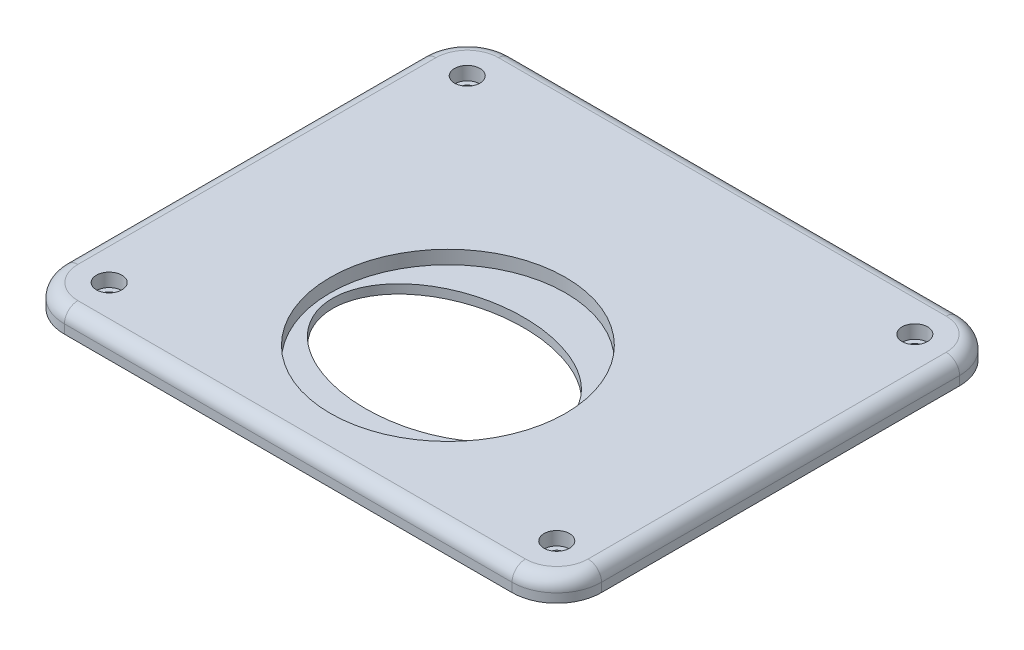
ISO-10303-21;
HEADER;
FILE_DESCRIPTION(('STEP AP214'),'2;1');
FILE_NAME('part.step','',(''),(''),'','','');
FILE_SCHEMA(('AUTOMOTIVE_DESIGN { 1 0 10303 214 1 1 1 1 }'));
ENDSEC;
DATA;
#1=APPLICATION_CONTEXT('core data for automotive mechanical design processes');
#2=APPLICATION_PROTOCOL_DEFINITION('international standard','automotive_design',2000,#1);
#3=PRODUCT_CONTEXT('',#1,'mechanical');
#4=PRODUCT('Part','Part','',(#3));
#5=PRODUCT_RELATED_PRODUCT_CATEGORY('part','',(#4));
#6=PRODUCT_DEFINITION_FORMATION('','',#4);
#7=PRODUCT_DEFINITION_CONTEXT('part definition',#1,'design');
#8=PRODUCT_DEFINITION('design','',#6,#7);
#9=PRODUCT_DEFINITION_SHAPE('','',#8);
#10=(LENGTH_UNIT() NAMED_UNIT(*) SI_UNIT(.MILLI.,.METRE.));
#11=(NAMED_UNIT(*) PLANE_ANGLE_UNIT() SI_UNIT($,.RADIAN.));
#12=(NAMED_UNIT(*) SI_UNIT($,.STERADIAN.) SOLID_ANGLE_UNIT());
#13=UNCERTAINTY_MEASURE_WITH_UNIT(LENGTH_MEASURE(1.E-05),#10,'distance_accuracy_value','');
#14=(GEOMETRIC_REPRESENTATION_CONTEXT(3) GLOBAL_UNCERTAINTY_ASSIGNED_CONTEXT((#13)) GLOBAL_UNIT_ASSIGNED_CONTEXT((#10,
#11,#12)) REPRESENTATION_CONTEXT('',''));
#15=CARTESIAN_POINT('',(0.,0.,0.));
#16=DIRECTION('',(0.,0.,1.));
#17=DIRECTION('',(1.,0.,0.));
#18=AXIS2_PLACEMENT_3D('',#15,#16,#17);
#19=CARTESIAN_POINT('',(50.,52.,25.6776695296637));
#20=DIRECTION('',(0.,1.,0.));
#21=DIRECTION('',(0.,0.,1.));
#22=AXIS2_PLACEMENT_3D('',#19,#20,#21);
#23=PLANE('',#22);
#24=CARTESIAN_POINT('',(-50.,52.,-54.3223304703363));
#25=DIRECTION('',(0.,1.,0.));
#26=DIRECTION('',(0.,0.,1.));
#27=AXIS2_PLACEMENT_3D('',#24,#25,#26);
#28=CIRCLE('',#27,1.7);
#29=CARTESIAN_POINT('',(-50.,52.,-52.6223304703363));
#30=VERTEX_POINT('',#29);
#31=EDGE_CURVE('E571',#30,#30,#28,.T.);
#32=ORIENTED_EDGE('',*,*,#31,.F.);
#33=EDGE_LOOP('',(#32));
#34=FACE_BOUND('',#33,.T.);
#35=CARTESIAN_POINT('',(-50.,52.,-54.3223304703363));
#36=DIRECTION('',(0.,1.,0.));
#37=DIRECTION('',(0.,0.,1.));
#38=AXIS2_PLACEMENT_3D('',#35,#36,#37);
#39=CIRCLE('',#38,2.85);
#40=CARTESIAN_POINT('',(-50.,52.,-51.4723304703363));
#41=VERTEX_POINT('',#40);
#42=EDGE_CURVE('E544',#41,#41,#39,.T.);
#43=ORIENTED_EDGE('',*,*,#42,.T.);
#44=EDGE_LOOP('',(#43));
#45=FACE_BOUND('',#44,.T.);
#46=ADVANCED_FACE('F311',(#34,#45),#23,.T.);
#47=CARTESIAN_POINT('',(50.,52.,-54.3223304703363));
#48=DIRECTION('',(0.,1.,0.));
#49=DIRECTION('',(0.,0.,1.));
#50=AXIS2_PLACEMENT_3D('',#47,#48,#49);
#51=CIRCLE('',#50,1.7);
#52=CARTESIAN_POINT('',(50.,52.,-52.6223304703363));
#53=VERTEX_POINT('',#52);
#54=EDGE_CURVE('E565',#53,#53,#51,.T.);
#55=ORIENTED_EDGE('',*,*,#54,.F.);
#56=EDGE_LOOP('',(#55));
#57=FACE_BOUND('',#56,.T.);
#58=CARTESIAN_POINT('',(50.,52.,-54.3223304703363));
#59=DIRECTION('',(0.,1.,0.));
#60=DIRECTION('',(0.,0.,1.));
#61=AXIS2_PLACEMENT_3D('',#58,#59,#60);
#62=CIRCLE('',#61,2.85);
#63=CARTESIAN_POINT('',(50.,52.,-51.4723304703363));
#64=VERTEX_POINT('',#63);
#65=EDGE_CURVE('E538',#64,#64,#62,.T.);
#66=ORIENTED_EDGE('',*,*,#65,.T.);
#67=EDGE_LOOP('',(#66));
#68=FACE_BOUND('',#67,.T.);
#69=ADVANCED_FACE('F587',(#57,#68),#23,.T.);
#70=CARTESIAN_POINT('',(50.,52.,25.6776695296637));
#71=DIRECTION('',(0.,1.,0.));
#72=DIRECTION('',(0.,0.,1.));
#73=AXIS2_PLACEMENT_3D('',#70,#71,#72);
#74=CIRCLE('',#73,1.7);
#75=CARTESIAN_POINT('',(50.,52.,27.3776695296637));
#76=VERTEX_POINT('',#75);
#77=EDGE_CURVE('E559',#76,#76,#74,.T.);
#78=ORIENTED_EDGE('',*,*,#77,.F.);
#79=EDGE_LOOP('',(#78));
#80=FACE_BOUND('',#79,.T.);
#81=CARTESIAN_POINT('',(50.,52.,25.6776695296637));
#82=DIRECTION('',(0.,1.,0.));
#83=DIRECTION('',(0.,0.,1.));
#84=AXIS2_PLACEMENT_3D('',#81,#82,#83);
#85=CIRCLE('',#84,2.85);
#86=CARTESIAN_POINT('',(50.,52.,28.5276695296637));
#87=VERTEX_POINT('',#86);
#88=EDGE_CURVE('E532',#87,#87,#85,.T.);
#89=ORIENTED_EDGE('',*,*,#88,.T.);
#90=EDGE_LOOP('',(#89));
#91=FACE_BOUND('',#90,.T.);
#92=ADVANCED_FACE('F698',(#80,#91),#23,.T.);
#93=CARTESIAN_POINT('',(-50.,52.,25.6776695296637));
#94=DIRECTION('',(0.,1.,0.));
#95=DIRECTION('',(0.,0.,1.));
#96=AXIS2_PLACEMENT_3D('',#93,#94,#95);
#97=CIRCLE('',#96,1.7);
#98=CARTESIAN_POINT('',(-50.,52.,27.3776695296637));
#99=VERTEX_POINT('',#98);
#100=EDGE_CURVE('E553',#99,#99,#97,.T.);
#101=ORIENTED_EDGE('',*,*,#100,.F.);
#102=EDGE_LOOP('',(#101));
#103=FACE_BOUND('',#102,.T.);
#104=CARTESIAN_POINT('',(-50.,52.,25.6776695296637));
#105=DIRECTION('',(0.,1.,0.));
#106=DIRECTION('',(0.,0.,1.));
#107=AXIS2_PLACEMENT_3D('',#104,#105,#106);
#108=CIRCLE('',#107,2.85);
#109=CARTESIAN_POINT('',(-50.,52.,28.5276695296637));
#110=VERTEX_POINT('',#109);
#111=EDGE_CURVE('E526',#110,#110,#108,.T.);
#112=ORIENTED_EDGE('',*,*,#111,.T.);
#113=EDGE_LOOP('',(#112));
#114=FACE_BOUND('',#113,.T.);
#115=ADVANCED_FACE('F700',(#103,#114),#23,.T.);
#116=CARTESIAN_POINT('',(0.,52.,0.777817459305204));
#117=DIRECTION('',(0.,1.,0.));
#118=DIRECTION('',(-1.,0.,0.));
#119=AXIS2_PLACEMENT_3D('',#116,#117,#118);
#120=ELLIPSE('',#119,25.,17.6776695296637);
#121=CARTESIAN_POINT('',(-25.,52.,0.777817459305209));
#122=VERTEX_POINT('',#121);
#123=EDGE_CURVE('E427',#122,#122,#120,.T.);
#124=ORIENTED_EDGE('',*,*,#123,.F.);
#125=EDGE_LOOP('',(#124));
#126=FACE_BOUND('',#125,.T.);
#127=CARTESIAN_POINT('',(0.,52.,0.));
#128=DIRECTION('',(0.,1.,0.));
#129=DIRECTION('',(0.,0.,1.));
#130=AXIS2_PLACEMENT_3D('',#127,#128,#129);
#131=CIRCLE('',#130,26.3);
#132=CARTESIAN_POINT('',(0.,52.,26.3));
#133=VERTEX_POINT('',#132);
#134=EDGE_CURVE('E513',#133,#133,#131,.T.);
#135=ORIENTED_EDGE('',*,*,#134,.T.);
#136=EDGE_LOOP('',(#135));
#137=FACE_BOUND('',#136,.T.);
#138=ADVANCED_FACE('F589',(#126,#137),#23,.T.);
#139=CARTESIAN_POINT('',(50.,50.,25.6776695296637));
#140=DIRECTION('',(0.,1.,0.));
#141=DIRECTION('',(0.,0.,1.));
#142=AXIS2_PLACEMENT_3D('',#139,#140,#141);
#143=PLANE('',#142);
#144=CARTESIAN_POINT('',(50.,50.,25.6776695296637));
#145=DIRECTION('',(0.,1.,0.));
#146=DIRECTION('',(0.,0.,1.));
#147=AXIS2_PLACEMENT_3D('',#144,#145,#146);
#148=CIRCLE('',#147,10.);
#149=CARTESIAN_POINT('',(50.,50.,35.6776695296637));
#150=VERTEX_POINT('',#149);
#151=CARTESIAN_POINT('',(60.,50.,25.6776695296637));
#152=VERTEX_POINT('',#151);
#153=EDGE_CURVE('E418',#150,#152,#148,.T.);
#154=ORIENTED_EDGE('',*,*,#153,.F.);
#155=DIRECTION('',(1.,0.,0.));
#156=VECTOR('',#155,1.);
#157=CARTESIAN_POINT('',(-50.,50.,35.6776695296637));
#158=LINE('',#157,#156);
#159=CARTESIAN_POINT('',(-50.,50.,35.6776695296637));
#160=VERTEX_POINT('',#159);
#161=EDGE_CURVE('E448',#160,#150,#158,.T.);
#162=ORIENTED_EDGE('',*,*,#161,.F.);
#163=CARTESIAN_POINT('',(-50.,50.,25.6776695296637));
#164=DIRECTION('',(0.,1.,0.));
#165=DIRECTION('',(0.,0.,1.));
#166=AXIS2_PLACEMENT_3D('',#163,#164,#165);
#167=CIRCLE('',#166,10.);
#168=CARTESIAN_POINT('',(-60.,50.,25.6776695296637));
#169=VERTEX_POINT('',#168);
#170=EDGE_CURVE('E445',#169,#160,#167,.T.);
#171=ORIENTED_EDGE('',*,*,#170,.F.);
#172=DIRECTION('',(0.,0.,1.));
#173=VECTOR('',#172,1.);
#174=CARTESIAN_POINT('',(-60.,50.,-54.3223304703363));
#175=LINE('',#174,#173);
#176=CARTESIAN_POINT('',(-60.,50.,-54.3223304703363));
#177=VERTEX_POINT('',#176);
#178=EDGE_CURVE('E442',#177,#169,#175,.T.);
#179=ORIENTED_EDGE('',*,*,#178,.F.);
#180=CARTESIAN_POINT('',(-50.,50.,-54.3223304703363));
#181=DIRECTION('',(0.,1.,0.));
#182=DIRECTION('',(0.,0.,1.));
#183=AXIS2_PLACEMENT_3D('',#180,#181,#182);
#184=CIRCLE('',#183,10.);
#185=CARTESIAN_POINT('',(-50.,50.,-64.3223304703363));
#186=VERTEX_POINT('',#185);
#187=EDGE_CURVE('E439',#186,#177,#184,.T.);
#188=ORIENTED_EDGE('',*,*,#187,.F.);
#189=DIRECTION('',(-1.,0.,0.));
#190=VECTOR('',#189,1.);
#191=CARTESIAN_POINT('',(50.,50.,-64.3223304703363));
#192=LINE('',#191,#190);
#193=CARTESIAN_POINT('',(50.,50.,-64.3223304703363));
#194=VERTEX_POINT('',#193);
#195=EDGE_CURVE('E436',#194,#186,#192,.T.);
#196=ORIENTED_EDGE('',*,*,#195,.F.);
#197=CARTESIAN_POINT('',(50.,50.,-54.3223304703363));
#198=DIRECTION('',(0.,1.,0.));
#199=DIRECTION('',(0.,0.,1.));
#200=AXIS2_PLACEMENT_3D('',#197,#198,#199);
#201=CIRCLE('',#200,10.);
#202=CARTESIAN_POINT('',(60.,50.,-54.3223304703363));
#203=VERTEX_POINT('',#202);
#204=EDGE_CURVE('E421',#203,#194,#201,.T.);
#205=ORIENTED_EDGE('',*,*,#204,.F.);
#206=DIRECTION('',(0.,0.,-1.));
#207=VECTOR('',#206,1.);
#208=CARTESIAN_POINT('',(60.,50.,25.6776695296637));
#209=LINE('',#208,#207);
#210=EDGE_CURVE('E403',#152,#203,#209,.T.);
#211=ORIENTED_EDGE('',*,*,#210,.F.);
#212=EDGE_LOOP('',(#154,#162,#171,#179,#188,#196,#205,#211));
#213=FACE_BOUND('',#212,.T.);
#214=CARTESIAN_POINT('',(0.,50.,0.777817459305204));
#215=DIRECTION('',(0.,1.,0.));
#216=DIRECTION('',(-1.,0.,0.));
#217=AXIS2_PLACEMENT_3D('',#214,#215,#216);
#218=ELLIPSE('',#217,25.,17.6776695296637);
#219=CARTESIAN_POINT('',(-25.,50.,0.777817459305209));
#220=VERTEX_POINT('',#219);
#221=EDGE_CURVE('E431',#220,#220,#218,.T.);
#222=ORIENTED_EDGE('',*,*,#221,.T.);
#223=EDGE_LOOP('',(#222));
#224=FACE_BOUND('',#223,.T.);
#225=CARTESIAN_POINT('',(-50.,50.,-54.3223304703363));
#226=DIRECTION('',(0.,1.,0.));
#227=DIRECTION('',(0.,0.,1.));
#228=AXIS2_PLACEMENT_3D('',#225,#226,#227);
#229=CIRCLE('',#228,1.7);
#230=CARTESIAN_POINT('',(-50.,50.,-52.6223304703363));
#231=VERTEX_POINT('',#230);
#232=EDGE_CURVE('E568',#231,#231,#229,.T.);
#233=ORIENTED_EDGE('',*,*,#232,.T.);
#234=EDGE_LOOP('',(#233));
#235=FACE_BOUND('',#234,.T.);
#236=CARTESIAN_POINT('',(50.,50.,-54.3223304703363));
#237=DIRECTION('',(0.,1.,0.));
#238=DIRECTION('',(0.,0.,1.));
#239=AXIS2_PLACEMENT_3D('',#236,#237,#238);
#240=CIRCLE('',#239,1.7);
#241=CARTESIAN_POINT('',(50.,50.,-52.6223304703363));
#242=VERTEX_POINT('',#241);
#243=EDGE_CURVE('E562',#242,#242,#240,.T.);
#244=ORIENTED_EDGE('',*,*,#243,.T.);
#245=EDGE_LOOP('',(#244));
#246=FACE_BOUND('',#245,.T.);
#247=CARTESIAN_POINT('',(50.,50.,25.6776695296637));
#248=DIRECTION('',(0.,1.,0.));
#249=DIRECTION('',(0.,0.,1.));
#250=AXIS2_PLACEMENT_3D('',#247,#248,#249);
#251=CIRCLE('',#250,1.7);
#252=CARTESIAN_POINT('',(50.,50.,27.3776695296637));
#253=VERTEX_POINT('',#252);
#254=EDGE_CURVE('E556',#253,#253,#251,.T.);
#255=ORIENTED_EDGE('',*,*,#254,.T.);
#256=EDGE_LOOP('',(#255));
#257=FACE_BOUND('',#256,.T.);
#258=CARTESIAN_POINT('',(-50.,50.,25.6776695296637));
#259=DIRECTION('',(0.,1.,0.));
#260=DIRECTION('',(0.,0.,1.));
#261=AXIS2_PLACEMENT_3D('',#258,#259,#260);
#262=CIRCLE('',#261,1.7);
#263=CARTESIAN_POINT('',(-50.,50.,27.3776695296637));
#264=VERTEX_POINT('',#263);
#265=EDGE_CURVE('E550',#264,#264,#262,.T.);
#266=ORIENTED_EDGE('',*,*,#265,.T.);
#267=EDGE_LOOP('',(#266));
#268=FACE_BOUND('',#267,.T.);
#269=ADVANCED_FACE('F415',(#213,#224,#235,#246,#257,#268),#143,.F.);
#270=CARTESIAN_POINT('',(50.,52.,25.6776695296637));
#271=DIRECTION('',(0.,-1.,0.));
#272=DIRECTION('',(0.,0.,-1.));
#273=AXIS2_PLACEMENT_3D('',#270,#271,#272);
#274=CYLINDRICAL_SURFACE('',#273,10.);
#275=DIRECTION('',(0.,-1.,0.));
#276=VECTOR('',#275,1.);
#277=CARTESIAN_POINT('',(60.,52.,25.6776695296637));
#278=LINE('',#277,#276);
#279=CARTESIAN_POINT('',(60.,52.,25.6776695296637));
#280=VERTEX_POINT('',#279);
#281=EDGE_CURVE('E400',#280,#152,#278,.T.);
#282=ORIENTED_EDGE('',*,*,#281,.F.);
#283=CARTESIAN_POINT('',(50.,52.,25.6776695296637));
#284=DIRECTION('',(0.,1.,0.));
#285=DIRECTION('',(0.,0.,1.));
#286=AXIS2_PLACEMENT_3D('',#283,#284,#285);
#287=CIRCLE('',#286,10.);
#288=CARTESIAN_POINT('',(50.,52.,35.6776695296637));
#289=VERTEX_POINT('',#288);
#290=EDGE_CURVE('E487',#280,#289,#287,.F.);
#291=ORIENTED_EDGE('',*,*,#290,.T.);
#292=DIRECTION('',(0.,-1.,0.));
#293=VECTOR('',#292,1.);
#294=CARTESIAN_POINT('',(50.,52.,35.6776695296637));
#295=LINE('',#294,#293);
#296=EDGE_CURVE('E425',#289,#150,#295,.T.);
#297=ORIENTED_EDGE('',*,*,#296,.T.);
#298=ORIENTED_EDGE('',*,*,#153,.T.);
#299=EDGE_LOOP('',(#282,#291,#297,#298));
#300=FACE_BOUND('',#299,.T.);
#301=ADVANCED_FACE('F423',(#300),#274,.T.);
#302=CARTESIAN_POINT('',(60.,52.,25.6776695296637));
#303=DIRECTION('',(-1.,0.,0.));
#304=DIRECTION('',(0.,0.,1.));
#305=AXIS2_PLACEMENT_3D('',#302,#303,#304);
#306=PLANE('',#305);
#307=DIRECTION('',(0.,-1.,0.));
#308=VECTOR('',#307,1.);
#309=CARTESIAN_POINT('',(60.,52.,-54.3223304703363));
#310=LINE('',#309,#308);
#311=CARTESIAN_POINT('',(60.,52.,-54.3223304703363));
#312=VERTEX_POINT('',#311);
#313=EDGE_CURVE('E411',#312,#203,#310,.T.);
#314=ORIENTED_EDGE('',*,*,#313,.F.);
#315=DIRECTION('',(0.,0.,1.));
#316=VECTOR('',#315,1.);
#317=CARTESIAN_POINT('',(60.,52.,25.6776695296637));
#318=LINE('',#317,#316);
#319=EDGE_CURVE('E406',#312,#280,#318,.T.);
#320=ORIENTED_EDGE('',*,*,#319,.T.);
#321=ORIENTED_EDGE('',*,*,#281,.T.);
#322=ORIENTED_EDGE('',*,*,#210,.T.);
#323=EDGE_LOOP('',(#314,#320,#321,#322));
#324=FACE_BOUND('',#323,.T.);
#325=ADVANCED_FACE('F402',(#324),#306,.F.);
#326=CARTESIAN_POINT('',(50.,52.,-54.3223304703363));
#327=DIRECTION('',(0.,-1.,0.));
#328=DIRECTION('',(0.,0.,-1.));
#329=AXIS2_PLACEMENT_3D('',#326,#327,#328);
#330=CYLINDRICAL_SURFACE('',#329,10.);
#331=DIRECTION('',(0.,-1.,0.));
#332=VECTOR('',#331,1.);
#333=CARTESIAN_POINT('',(50.,52.,-64.3223304703363));
#334=LINE('',#333,#332);
#335=CARTESIAN_POINT('',(50.,52.,-64.3223304703363));
#336=VERTEX_POINT('',#335);
#337=EDGE_CURVE('E459',#336,#194,#334,.T.);
#338=ORIENTED_EDGE('',*,*,#337,.F.);
#339=CARTESIAN_POINT('',(50.,52.,-54.3223304703363));
#340=DIRECTION('',(0.,1.,0.));
#341=DIRECTION('',(0.,0.,1.));
#342=AXIS2_PLACEMENT_3D('',#339,#340,#341);
#343=CIRCLE('',#342,10.);
#344=EDGE_CURVE('E320',#336,#312,#343,.F.);
#345=ORIENTED_EDGE('',*,*,#344,.T.);
#346=ORIENTED_EDGE('',*,*,#313,.T.);
#347=ORIENTED_EDGE('',*,*,#204,.T.);
#348=EDGE_LOOP('',(#338,#345,#346,#347));
#349=FACE_BOUND('',#348,.T.);
#350=ADVANCED_FACE('F610',(#349),#330,.T.);
#351=CARTESIAN_POINT('',(50.,52.,-64.3223304703363));
#352=DIRECTION('',(0.,0.,1.));
#353=DIRECTION('',(1.,0.,0.));
#354=AXIS2_PLACEMENT_3D('',#351,#352,#353);
#355=PLANE('',#354);
#356=DIRECTION('',(0.,-1.,0.));
#357=VECTOR('',#356,1.);
#358=CARTESIAN_POINT('',(-50.,52.,-64.3223304703363));
#359=LINE('',#358,#357);
#360=CARTESIAN_POINT('',(-50.,52.,-64.3223304703363));
#361=VERTEX_POINT('',#360);
#362=EDGE_CURVE('E457',#361,#186,#359,.T.);
#363=ORIENTED_EDGE('',*,*,#362,.F.);
#364=DIRECTION('',(1.,0.,0.));
#365=VECTOR('',#364,1.);
#366=CARTESIAN_POINT('',(50.,52.,-64.3223304703363));
#367=LINE('',#366,#365);
#368=EDGE_CURVE('E12',#361,#336,#367,.T.);
#369=ORIENTED_EDGE('',*,*,#368,.T.);
#370=ORIENTED_EDGE('',*,*,#337,.T.);
#371=ORIENTED_EDGE('',*,*,#195,.T.);
#372=EDGE_LOOP('',(#363,#369,#370,#371));
#373=FACE_BOUND('',#372,.T.);
#374=ADVANCED_FACE('F606',(#373),#355,.F.);
#375=CARTESIAN_POINT('',(-50.,52.,-54.3223304703363));
#376=DIRECTION('',(0.,-1.,0.));
#377=DIRECTION('',(0.,0.,-1.));
#378=AXIS2_PLACEMENT_3D('',#375,#376,#377);
#379=CYLINDRICAL_SURFACE('',#378,10.);
#380=DIRECTION('',(0.,-1.,0.));
#381=VECTOR('',#380,1.);
#382=CARTESIAN_POINT('',(-60.,52.,-54.3223304703363));
#383=LINE('',#382,#381);
#384=CARTESIAN_POINT('',(-60.,52.,-54.3223304703363));
#385=VERTEX_POINT('',#384);
#386=EDGE_CURVE('E455',#385,#177,#383,.T.);
#387=ORIENTED_EDGE('',*,*,#386,.F.);
#388=CARTESIAN_POINT('',(-50.,52.,-54.3223304703363));
#389=DIRECTION('',(0.,1.,0.));
#390=DIRECTION('',(0.,0.,1.));
#391=AXIS2_PLACEMENT_3D('',#388,#389,#390);
#392=CIRCLE('',#391,10.);
#393=EDGE_CURVE('E478',#385,#361,#392,.F.);
#394=ORIENTED_EDGE('',*,*,#393,.T.);
#395=ORIENTED_EDGE('',*,*,#362,.T.);
#396=ORIENTED_EDGE('',*,*,#187,.T.);
#397=EDGE_LOOP('',(#387,#394,#395,#396));
#398=FACE_BOUND('',#397,.T.);
#399=ADVANCED_FACE('F602',(#398),#379,.T.);
#400=CARTESIAN_POINT('',(-60.,52.,-54.3223304703363));
#401=DIRECTION('',(1.,0.,0.));
#402=DIRECTION('',(0.,0.,-1.));
#403=AXIS2_PLACEMENT_3D('',#400,#401,#402);
#404=PLANE('',#403);
#405=DIRECTION('',(0.,-1.,0.));
#406=VECTOR('',#405,1.);
#407=CARTESIAN_POINT('',(-60.,52.,25.6776695296637));
#408=LINE('',#407,#406);
#409=CARTESIAN_POINT('',(-60.,52.,25.6776695296637));
#410=VERTEX_POINT('',#409);
#411=EDGE_CURVE('E453',#410,#169,#408,.T.);
#412=ORIENTED_EDGE('',*,*,#411,.F.);
#413=DIRECTION('',(0.,0.,-1.));
#414=VECTOR('',#413,1.);
#415=CARTESIAN_POINT('',(-60.,52.,-54.3223304703363));
#416=LINE('',#415,#414);
#417=EDGE_CURVE('E481',#410,#385,#416,.T.);
#418=ORIENTED_EDGE('',*,*,#417,.T.);
#419=ORIENTED_EDGE('',*,*,#386,.T.);
#420=ORIENTED_EDGE('',*,*,#178,.T.);
#421=EDGE_LOOP('',(#412,#418,#419,#420));
#422=FACE_BOUND('',#421,.T.);
#423=ADVANCED_FACE('F598',(#422),#404,.F.);
#424=CARTESIAN_POINT('',(-50.,52.,25.6776695296637));
#425=DIRECTION('',(0.,-1.,0.));
#426=DIRECTION('',(0.,0.,-1.));
#427=AXIS2_PLACEMENT_3D('',#424,#425,#426);
#428=CYLINDRICAL_SURFACE('',#427,10.);
#429=DIRECTION('',(0.,-1.,0.));
#430=VECTOR('',#429,1.);
#431=CARTESIAN_POINT('',(-50.,52.,35.6776695296637));
#432=LINE('',#431,#430);
#433=CARTESIAN_POINT('',(-50.,52.,35.6776695296637));
#434=VERTEX_POINT('',#433);
#435=EDGE_CURVE('E451',#434,#160,#432,.T.);
#436=ORIENTED_EDGE('',*,*,#435,.F.);
#437=CARTESIAN_POINT('',(-50.,52.,25.6776695296637));
#438=DIRECTION('',(0.,1.,0.));
#439=DIRECTION('',(0.,0.,1.));
#440=AXIS2_PLACEMENT_3D('',#437,#438,#439);
#441=CIRCLE('',#440,10.);
#442=EDGE_CURVE('E483',#434,#410,#441,.F.);
#443=ORIENTED_EDGE('',*,*,#442,.T.);
#444=ORIENTED_EDGE('',*,*,#411,.T.);
#445=ORIENTED_EDGE('',*,*,#170,.T.);
#446=EDGE_LOOP('',(#436,#443,#444,#445));
#447=FACE_BOUND('',#446,.T.);
#448=ADVANCED_FACE('F594',(#447),#428,.T.);
#449=CARTESIAN_POINT('',(-50.,52.,35.6776695296637));
#450=DIRECTION('',(0.,0.,-1.));
#451=DIRECTION('',(-1.,0.,0.));
#452=AXIS2_PLACEMENT_3D('',#449,#450,#451);
#453=PLANE('',#452);
#454=ORIENTED_EDGE('',*,*,#296,.F.);
#455=DIRECTION('',(-1.,0.,0.));
#456=VECTOR('',#455,1.);
#457=CARTESIAN_POINT('',(-50.,52.,35.6776695296637));
#458=LINE('',#457,#456);
#459=EDGE_CURVE('E485',#289,#434,#458,.T.);
#460=ORIENTED_EDGE('',*,*,#459,.T.);
#461=ORIENTED_EDGE('',*,*,#435,.T.);
#462=ORIENTED_EDGE('',*,*,#161,.T.);
#463=EDGE_LOOP('',(#454,#460,#461,#462));
#464=FACE_BOUND('',#463,.T.);
#465=ADVANCED_FACE('F582',(#464),#453,.F.);
#466=DIRECTION('',(0.,-1.,0.));
#467=VECTOR('',#466,1.);
#468=SURFACE_OF_LINEAR_EXTRUSION('',#120,#467);
#469=ORIENTED_EDGE('',*,*,#123,.T.);
#470=EDGE_LOOP('',(#469));
#471=FACE_BOUND('',#470,.T.);
#472=ORIENTED_EDGE('',*,*,#221,.F.);
#473=EDGE_LOOP('',(#472));
#474=FACE_BOUND('',#473,.T.);
#475=ADVANCED_FACE('F577',(#471,#474),#468,.T.);
#476=CARTESIAN_POINT('',(-50.,52.,-54.3223304703363));
#477=DIRECTION('',(0.,-1.,0.));
#478=DIRECTION('',(0.,0.,-1.));
#479=AXIS2_PLACEMENT_3D('',#476,#477,#478);
#480=CYLINDRICAL_SURFACE('',#479,1.7);
#481=ORIENTED_EDGE('',*,*,#31,.T.);
#482=EDGE_LOOP('',(#481));
#483=FACE_BOUND('',#482,.T.);
#484=ORIENTED_EDGE('',*,*,#232,.F.);
#485=EDGE_LOOP('',(#484));
#486=FACE_BOUND('',#485,.T.);
#487=ADVANCED_FACE('F581',(#483,#486),#480,.F.);
#488=CARTESIAN_POINT('',(50.,52.,-54.3223304703363));
#489=DIRECTION('',(0.,-1.,0.));
#490=DIRECTION('',(0.,0.,-1.));
#491=AXIS2_PLACEMENT_3D('',#488,#489,#490);
#492=CYLINDRICAL_SURFACE('',#491,1.7);
#493=ORIENTED_EDGE('',*,*,#54,.T.);
#494=EDGE_LOOP('',(#493));
#495=FACE_BOUND('',#494,.T.);
#496=ORIENTED_EDGE('',*,*,#243,.F.);
#497=EDGE_LOOP('',(#496));
#498=FACE_BOUND('',#497,.T.);
#499=ADVANCED_FACE('F713',(#495,#498),#492,.F.);
#500=CARTESIAN_POINT('',(50.,52.,25.6776695296637));
#501=DIRECTION('',(0.,-1.,0.));
#502=DIRECTION('',(0.,0.,-1.));
#503=AXIS2_PLACEMENT_3D('',#500,#501,#502);
#504=CYLINDRICAL_SURFACE('',#503,1.7);
#505=ORIENTED_EDGE('',*,*,#77,.T.);
#506=EDGE_LOOP('',(#505));
#507=FACE_BOUND('',#506,.T.);
#508=ORIENTED_EDGE('',*,*,#254,.F.);
#509=EDGE_LOOP('',(#508));
#510=FACE_BOUND('',#509,.T.);
#511=ADVANCED_FACE('F710',(#507,#510),#504,.F.);
#512=CARTESIAN_POINT('',(-50.,52.,25.6776695296637));
#513=DIRECTION('',(0.,-1.,0.));
#514=DIRECTION('',(0.,0.,-1.));
#515=AXIS2_PLACEMENT_3D('',#512,#513,#514);
#516=CYLINDRICAL_SURFACE('',#515,1.7);
#517=ORIENTED_EDGE('',*,*,#100,.T.);
#518=EDGE_LOOP('',(#517));
#519=FACE_BOUND('',#518,.T.);
#520=ORIENTED_EDGE('',*,*,#265,.F.);
#521=EDGE_LOOP('',(#520));
#522=FACE_BOUND('',#521,.T.);
#523=ADVANCED_FACE('F678',(#519,#522),#516,.F.);
#524=CARTESIAN_POINT('',(50.,55.,25.6776695296637));
#525=DIRECTION('',(0.,1.,0.));
#526=DIRECTION('',(0.,0.,1.));
#527=AXIS2_PLACEMENT_3D('',#524,#525,#526);
#528=PLANE('',#527);
#529=DIRECTION('',(1.,0.,0.));
#530=VECTOR('',#529,1.);
#531=CARTESIAN_POINT('',(-50.,55.,-61.3223304703363));
#532=LINE('',#531,#530);
#533=CARTESIAN_POINT('',(50.,55.,-61.3223304703363));
#534=VERTEX_POINT('',#533);
#535=CARTESIAN_POINT('',(-50.,55.,-61.3223304703363));
#536=VERTEX_POINT('',#535);
#537=EDGE_CURVE('E410',#534,#536,#532,.F.);
#538=ORIENTED_EDGE('',*,*,#537,.T.);
#539=CARTESIAN_POINT('',(-50.,55.,-54.3223304703363));
#540=DIRECTION('',(0.,1.,0.));
#541=DIRECTION('',(0.,0.,1.));
#542=AXIS2_PLACEMENT_3D('',#539,#540,#541);
#543=CIRCLE('',#542,7.);
#544=CARTESIAN_POINT('',(-57.,55.,-54.3223304703363));
#545=VERTEX_POINT('',#544);
#546=EDGE_CURVE('E475',#536,#545,#543,.T.);
#547=ORIENTED_EDGE('',*,*,#546,.T.);
#548=DIRECTION('',(0.,0.,-1.));
#549=VECTOR('',#548,1.);
#550=CARTESIAN_POINT('',(-57.,55.,25.6776695296637));
#551=LINE('',#550,#549);
#552=CARTESIAN_POINT('',(-57.,55.,25.6776695296637));
#553=VERTEX_POINT('',#552);
#554=EDGE_CURVE('E473',#545,#553,#551,.F.);
#555=ORIENTED_EDGE('',*,*,#554,.T.);
#556=CARTESIAN_POINT('',(-50.,55.,25.6776695296637));
#557=DIRECTION('',(0.,1.,0.));
#558=DIRECTION('',(0.,0.,1.));
#559=AXIS2_PLACEMENT_3D('',#556,#557,#558);
#560=CIRCLE('',#559,7.);
#561=CARTESIAN_POINT('',(-50.,55.,32.6776695296637));
#562=VERTEX_POINT('',#561);
#563=EDGE_CURVE('E471',#553,#562,#560,.T.);
#564=ORIENTED_EDGE('',*,*,#563,.T.);
#565=DIRECTION('',(-1.,0.,0.));
#566=VECTOR('',#565,1.);
#567=CARTESIAN_POINT('',(50.,55.,32.6776695296637));
#568=LINE('',#567,#566);
#569=CARTESIAN_POINT('',(50.,55.,32.6776695296637));
#570=VERTEX_POINT('',#569);
#571=EDGE_CURVE('E469',#562,#570,#568,.F.);
#572=ORIENTED_EDGE('',*,*,#571,.T.);
#573=CARTESIAN_POINT('',(50.,55.,25.6776695296637));
#574=DIRECTION('',(0.,1.,0.));
#575=DIRECTION('',(0.,0.,1.));
#576=AXIS2_PLACEMENT_3D('',#573,#574,#575);
#577=CIRCLE('',#576,7.);
#578=CARTESIAN_POINT('',(57.,55.,25.6776695296637));
#579=VERTEX_POINT('',#578);
#580=EDGE_CURVE('E467',#570,#579,#577,.T.);
#581=ORIENTED_EDGE('',*,*,#580,.T.);
#582=DIRECTION('',(0.,0.,1.));
#583=VECTOR('',#582,1.);
#584=CARTESIAN_POINT('',(57.,55.,-54.3223304703363));
#585=LINE('',#584,#583);
#586=CARTESIAN_POINT('',(57.,55.,-54.3223304703363));
#587=VERTEX_POINT('',#586);
#588=EDGE_CURVE('E465',#579,#587,#585,.F.);
#589=ORIENTED_EDGE('',*,*,#588,.T.);
#590=CARTESIAN_POINT('',(50.,55.,-54.3223304703363));
#591=DIRECTION('',(0.,1.,0.));
#592=DIRECTION('',(0.,0.,1.));
#593=AXIS2_PLACEMENT_3D('',#590,#591,#592);
#594=CIRCLE('',#593,7.);
#595=EDGE_CURVE('E463',#587,#534,#594,.T.);
#596=ORIENTED_EDGE('',*,*,#595,.T.);
#597=EDGE_LOOP('',(#538,#547,#555,#564,#572,#581,#589,#596));
#598=FACE_BOUND('',#597,.T.);
#599=CARTESIAN_POINT('',(-50.,55.,25.6776695296637));
#600=DIRECTION('',(0.,1.,0.));
#601=DIRECTION('',(0.,0.,1.));
#602=AXIS2_PLACEMENT_3D('',#599,#600,#601);
#603=CIRCLE('',#602,2.85);
#604=CARTESIAN_POINT('',(-50.,55.,28.5276695296637));
#605=VERTEX_POINT('',#604);
#606=EDGE_CURVE('E529',#605,#605,#603,.T.);
#607=ORIENTED_EDGE('',*,*,#606,.F.);
#608=EDGE_LOOP('',(#607));
#609=FACE_BOUND('',#608,.T.);
#610=CARTESIAN_POINT('',(50.,55.,-54.3223304703363));
#611=DIRECTION('',(0.,1.,0.));
#612=DIRECTION('',(0.,0.,1.));
#613=AXIS2_PLACEMENT_3D('',#610,#611,#612);
#614=CIRCLE('',#613,2.85);
#615=CARTESIAN_POINT('',(50.,55.,-51.4723304703363));
#616=VERTEX_POINT('',#615);
#617=EDGE_CURVE('E541',#616,#616,#614,.T.);
#618=ORIENTED_EDGE('',*,*,#617,.F.);
#619=EDGE_LOOP('',(#618));
#620=FACE_BOUND('',#619,.T.);
#621=CARTESIAN_POINT('',(-50.,55.,-54.3223304703363));
#622=DIRECTION('',(0.,1.,0.));
#623=DIRECTION('',(0.,0.,1.));
#624=AXIS2_PLACEMENT_3D('',#621,#622,#623);
#625=CIRCLE('',#624,2.85);
#626=CARTESIAN_POINT('',(-50.,55.,-51.4723304703363));
#627=VERTEX_POINT('',#626);
#628=EDGE_CURVE('E547',#627,#627,#625,.T.);
#629=ORIENTED_EDGE('',*,*,#628,.F.);
#630=EDGE_LOOP('',(#629));
#631=FACE_BOUND('',#630,.T.);
#632=CARTESIAN_POINT('',(50.,55.,25.6776695296637));
#633=DIRECTION('',(0.,1.,0.));
#634=DIRECTION('',(0.,0.,1.));
#635=AXIS2_PLACEMENT_3D('',#632,#633,#634);
#636=CIRCLE('',#635,2.85);
#637=CARTESIAN_POINT('',(50.,55.,28.5276695296637));
#638=VERTEX_POINT('',#637);
#639=EDGE_CURVE('E535',#638,#638,#636,.T.);
#640=ORIENTED_EDGE('',*,*,#639,.F.);
#641=EDGE_LOOP('',(#640));
#642=FACE_BOUND('',#641,.T.);
#643=CARTESIAN_POINT('',(0.,55.,0.));
#644=DIRECTION('',(0.,1.,0.));
#645=DIRECTION('',(0.,0.,1.));
#646=AXIS2_PLACEMENT_3D('',#643,#644,#645);
#647=CIRCLE('',#646,26.3);
#648=CARTESIAN_POINT('',(0.,55.,26.3));
#649=VERTEX_POINT('',#648);
#650=EDGE_CURVE('E519',#649,#649,#647,.T.);
#651=ORIENTED_EDGE('',*,*,#650,.F.);
#652=EDGE_LOOP('',(#651));
#653=FACE_BOUND('',#652,.T.);
#654=ADVANCED_FACE('F669',(#598,#609,#620,#631,#642,#653),#528,.T.);
#655=CARTESIAN_POINT('',(-50.,55.,-54.3223304703363));
#656=DIRECTION('',(0.,-1.,0.));
#657=DIRECTION('',(0.,0.,-1.));
#658=AXIS2_PLACEMENT_3D('',#655,#656,#657);
#659=CYLINDRICAL_SURFACE('',#658,2.85);
#660=ORIENTED_EDGE('',*,*,#628,.T.);
#661=EDGE_LOOP('',(#660));
#662=FACE_BOUND('',#661,.T.);
#663=ORIENTED_EDGE('',*,*,#42,.F.);
#664=EDGE_LOOP('',(#663));
#665=FACE_BOUND('',#664,.T.);
#666=ADVANCED_FACE('F677',(#662,#665),#659,.F.);
#667=CARTESIAN_POINT('',(50.,55.,-54.3223304703363));
#668=DIRECTION('',(0.,-1.,0.));
#669=DIRECTION('',(0.,0.,-1.));
#670=AXIS2_PLACEMENT_3D('',#667,#668,#669);
#671=CYLINDRICAL_SURFACE('',#670,2.85);
#672=ORIENTED_EDGE('',*,*,#617,.T.);
#673=EDGE_LOOP('',(#672));
#674=FACE_BOUND('',#673,.T.);
#675=ORIENTED_EDGE('',*,*,#65,.F.);
#676=EDGE_LOOP('',(#675));
#677=FACE_BOUND('',#676,.T.);
#678=ADVANCED_FACE('F694',(#674,#677),#671,.F.);
#679=CARTESIAN_POINT('',(50.,55.,25.6776695296637));
#680=DIRECTION('',(0.,-1.,0.));
#681=DIRECTION('',(0.,0.,-1.));
#682=AXIS2_PLACEMENT_3D('',#679,#680,#681);
#683=CYLINDRICAL_SURFACE('',#682,2.85);
#684=ORIENTED_EDGE('',*,*,#639,.T.);
#685=EDGE_LOOP('',(#684));
#686=FACE_BOUND('',#685,.T.);
#687=ORIENTED_EDGE('',*,*,#88,.F.);
#688=EDGE_LOOP('',(#687));
#689=FACE_BOUND('',#688,.T.);
#690=ADVANCED_FACE('F691',(#686,#689),#683,.F.);
#691=CARTESIAN_POINT('',(-50.,55.,25.6776695296637));
#692=DIRECTION('',(0.,-1.,0.));
#693=DIRECTION('',(0.,0.,-1.));
#694=AXIS2_PLACEMENT_3D('',#691,#692,#693);
#695=CYLINDRICAL_SURFACE('',#694,2.85);
#696=ORIENTED_EDGE('',*,*,#606,.T.);
#697=EDGE_LOOP('',(#696));
#698=FACE_BOUND('',#697,.T.);
#699=ORIENTED_EDGE('',*,*,#111,.F.);
#700=EDGE_LOOP('',(#699));
#701=FACE_BOUND('',#700,.T.);
#702=ADVANCED_FACE('F649',(#698,#701),#695,.F.);
#703=CARTESIAN_POINT('',(0.,55.,0.));
#704=DIRECTION('',(0.,-1.,0.));
#705=DIRECTION('',(0.,0.,-1.));
#706=AXIS2_PLACEMENT_3D('',#703,#704,#705);
#707=CYLINDRICAL_SURFACE('',#706,26.3);
#708=ORIENTED_EDGE('',*,*,#650,.T.);
#709=EDGE_LOOP('',(#708));
#710=FACE_BOUND('',#709,.T.);
#711=ORIENTED_EDGE('',*,*,#134,.F.);
#712=EDGE_LOOP('',(#711));
#713=FACE_BOUND('',#712,.T.);
#714=ADVANCED_FACE('F644',(#710,#713),#707,.F.);
#715=CARTESIAN_POINT('',(50.,52.,25.6776695296637));
#716=DIRECTION('',(0.,1.,0.));
#717=DIRECTION('',(0.,0.,1.));
#718=AXIS2_PLACEMENT_3D('',#715,#716,#717);
#719=TOROIDAL_SURFACE('',#718,7.,3.);
#720=CARTESIAN_POINT('',(50.,52.,32.6776695296637));
#721=DIRECTION('',(-1.,0.,0.));
#722=DIRECTION('',(0.,0.,1.));
#723=AXIS2_PLACEMENT_3D('',#720,#721,#722);
#724=CIRCLE('',#723,3.);
#725=EDGE_CURVE('E506',#289,#570,#724,.T.);
#726=ORIENTED_EDGE('',*,*,#725,.F.);
#727=ORIENTED_EDGE('',*,*,#290,.F.);
#728=CARTESIAN_POINT('',(57.,52.,25.6776695296637));
#729=DIRECTION('',(0.,0.,-1.));
#730=DIRECTION('',(-1.,0.,0.));
#731=AXIS2_PLACEMENT_3D('',#728,#729,#730);
#732=CIRCLE('',#731,3.);
#733=EDGE_CURVE('E315',#579,#280,#732,.T.);
#734=ORIENTED_EDGE('',*,*,#733,.F.);
#735=ORIENTED_EDGE('',*,*,#580,.F.);
#736=EDGE_LOOP('',(#726,#727,#734,#735));
#737=FACE_BOUND('',#736,.T.);
#738=ADVANCED_FACE('F313',(#737),#719,.T.);
#739=CARTESIAN_POINT('',(57.,52.,25.6776695296637));
#740=DIRECTION('',(0.,0.,-1.));
#741=DIRECTION('',(-1.,0.,0.));
#742=AXIS2_PLACEMENT_3D('',#739,#740,#741);
#743=CYLINDRICAL_SURFACE('',#742,3.);
#744=ORIENTED_EDGE('',*,*,#733,.T.);
#745=ORIENTED_EDGE('',*,*,#319,.F.);
#746=CARTESIAN_POINT('',(57.,52.,-54.3223304703363));
#747=DIRECTION('',(0.,0.,-1.));
#748=DIRECTION('',(-1.,0.,0.));
#749=AXIS2_PLACEMENT_3D('',#746,#747,#748);
#750=CIRCLE('',#749,3.);
#751=EDGE_CURVE('E504',#587,#312,#750,.T.);
#752=ORIENTED_EDGE('',*,*,#751,.F.);
#753=ORIENTED_EDGE('',*,*,#588,.F.);
#754=EDGE_LOOP('',(#744,#745,#752,#753));
#755=FACE_BOUND('',#754,.T.);
#756=ADVANCED_FACE('F639',(#755),#743,.T.);
#757=CARTESIAN_POINT('',(-50.,52.,32.6776695296637));
#758=DIRECTION('',(1.,0.,0.));
#759=DIRECTION('',(0.,0.,-1.));
#760=AXIS2_PLACEMENT_3D('',#757,#758,#759);
#761=CYLINDRICAL_SURFACE('',#760,3.);
#762=ORIENTED_EDGE('',*,*,#725,.T.);
#763=ORIENTED_EDGE('',*,*,#571,.F.);
#764=CARTESIAN_POINT('',(-50.,52.,32.6776695296637));
#765=DIRECTION('',(-1.,0.,0.));
#766=DIRECTION('',(0.,0.,1.));
#767=AXIS2_PLACEMENT_3D('',#764,#765,#766);
#768=CIRCLE('',#767,3.);
#769=EDGE_CURVE('E501',#434,#562,#768,.T.);
#770=ORIENTED_EDGE('',*,*,#769,.F.);
#771=ORIENTED_EDGE('',*,*,#459,.F.);
#772=EDGE_LOOP('',(#762,#763,#770,#771));
#773=FACE_BOUND('',#772,.T.);
#774=ADVANCED_FACE('F636',(#773),#761,.T.);
#775=CARTESIAN_POINT('',(50.,52.,-54.3223304703363));
#776=DIRECTION('',(0.,1.,0.));
#777=DIRECTION('',(0.,0.,1.));
#778=AXIS2_PLACEMENT_3D('',#775,#776,#777);
#779=TOROIDAL_SURFACE('',#778,7.,3.);
#780=ORIENTED_EDGE('',*,*,#751,.T.);
#781=ORIENTED_EDGE('',*,*,#344,.F.);
#782=CARTESIAN_POINT('',(50.,52.,-61.3223304703363));
#783=DIRECTION('',(-1.,0.,0.));
#784=DIRECTION('',(0.,0.,1.));
#785=AXIS2_PLACEMENT_3D('',#782,#783,#784);
#786=CIRCLE('',#785,3.);
#787=EDGE_CURVE('E498',#534,#336,#786,.T.);
#788=ORIENTED_EDGE('',*,*,#787,.F.);
#789=ORIENTED_EDGE('',*,*,#595,.F.);
#790=EDGE_LOOP('',(#780,#781,#788,#789));
#791=FACE_BOUND('',#790,.T.);
#792=ADVANCED_FACE('F632',(#791),#779,.T.);
#793=CARTESIAN_POINT('',(-50.,52.,25.6776695296637));
#794=DIRECTION('',(0.,1.,0.));
#795=DIRECTION('',(0.,0.,1.));
#796=AXIS2_PLACEMENT_3D('',#793,#794,#795);
#797=TOROIDAL_SURFACE('',#796,7.,3.);
#798=ORIENTED_EDGE('',*,*,#769,.T.);
#799=ORIENTED_EDGE('',*,*,#563,.F.);
#800=CARTESIAN_POINT('',(-57.,52.,25.6776695296637));
#801=DIRECTION('',(0.,0.,-1.));
#802=DIRECTION('',(-1.,0.,0.));
#803=AXIS2_PLACEMENT_3D('',#800,#801,#802);
#804=CIRCLE('',#803,3.);
#805=EDGE_CURVE('E495',#410,#553,#804,.T.);
#806=ORIENTED_EDGE('',*,*,#805,.F.);
#807=ORIENTED_EDGE('',*,*,#442,.F.);
#808=EDGE_LOOP('',(#798,#799,#806,#807));
#809=FACE_BOUND('',#808,.T.);
#810=ADVANCED_FACE('F628',(#809),#797,.T.);
#811=CARTESIAN_POINT('',(50.,52.,-61.3223304703363));
#812=DIRECTION('',(-1.,0.,0.));
#813=DIRECTION('',(0.,0.,1.));
#814=AXIS2_PLACEMENT_3D('',#811,#812,#813);
#815=CYLINDRICAL_SURFACE('',#814,3.);
#816=ORIENTED_EDGE('',*,*,#787,.T.);
#817=ORIENTED_EDGE('',*,*,#368,.F.);
#818=CARTESIAN_POINT('',(-50.,52.,-61.3223304703363));
#819=DIRECTION('',(-1.,0.,0.));
#820=DIRECTION('',(0.,0.,1.));
#821=AXIS2_PLACEMENT_3D('',#818,#819,#820);
#822=CIRCLE('',#821,3.);
#823=EDGE_CURVE('E493',#536,#361,#822,.T.);
#824=ORIENTED_EDGE('',*,*,#823,.F.);
#825=ORIENTED_EDGE('',*,*,#537,.F.);
#826=EDGE_LOOP('',(#816,#817,#824,#825));
#827=FACE_BOUND('',#826,.T.);
#828=ADVANCED_FACE('F624',(#827),#815,.T.);
#829=CARTESIAN_POINT('',(-57.,52.,-54.3223304703363));
#830=DIRECTION('',(0.,0.,1.));
#831=DIRECTION('',(1.,0.,0.));
#832=AXIS2_PLACEMENT_3D('',#829,#830,#831);
#833=CYLINDRICAL_SURFACE('',#832,3.);
#834=ORIENTED_EDGE('',*,*,#805,.T.);
#835=ORIENTED_EDGE('',*,*,#554,.F.);
#836=CARTESIAN_POINT('',(-57.,52.,-54.3223304703363));
#837=DIRECTION('',(0.,0.,-1.));
#838=DIRECTION('',(-1.,0.,0.));
#839=AXIS2_PLACEMENT_3D('',#836,#837,#838);
#840=CIRCLE('',#839,3.);
#841=EDGE_CURVE('E491',#385,#545,#840,.T.);
#842=ORIENTED_EDGE('',*,*,#841,.F.);
#843=ORIENTED_EDGE('',*,*,#417,.F.);
#844=EDGE_LOOP('',(#834,#835,#842,#843));
#845=FACE_BOUND('',#844,.T.);
#846=ADVANCED_FACE('F620',(#845),#833,.T.);
#847=CARTESIAN_POINT('',(-50.,52.,-54.3223304703363));
#848=DIRECTION('',(0.,1.,0.));
#849=DIRECTION('',(0.,0.,1.));
#850=AXIS2_PLACEMENT_3D('',#847,#848,#849);
#851=TOROIDAL_SURFACE('',#850,7.,3.);
#852=ORIENTED_EDGE('',*,*,#823,.T.);
#853=ORIENTED_EDGE('',*,*,#393,.F.);
#854=ORIENTED_EDGE('',*,*,#841,.T.);
#855=ORIENTED_EDGE('',*,*,#546,.F.);
#856=EDGE_LOOP('',(#852,#853,#854,#855));
#857=FACE_BOUND('',#856,.T.);
#858=ADVANCED_FACE('F617',(#857),#851,.T.);
#859=CLOSED_SHELL('',(#46,#69,#92,#115,#138,#269,#301,#325,#350,#374,#399,#423,#448,#465,#475,
#487,#499,#511,#523,#654,#666,#678,#690,#702,#714,#738,#756,#774,#792,#810,#828,#846,#858));
#860=MANIFOLD_SOLID_BREP('B2',#859);
#861=ADVANCED_BREP_SHAPE_REPRESENTATION('',(#18,#860),#14);
#862=SHAPE_DEFINITION_REPRESENTATION(#9,#861);
ENDSEC;
END-ISO-10303-21;
